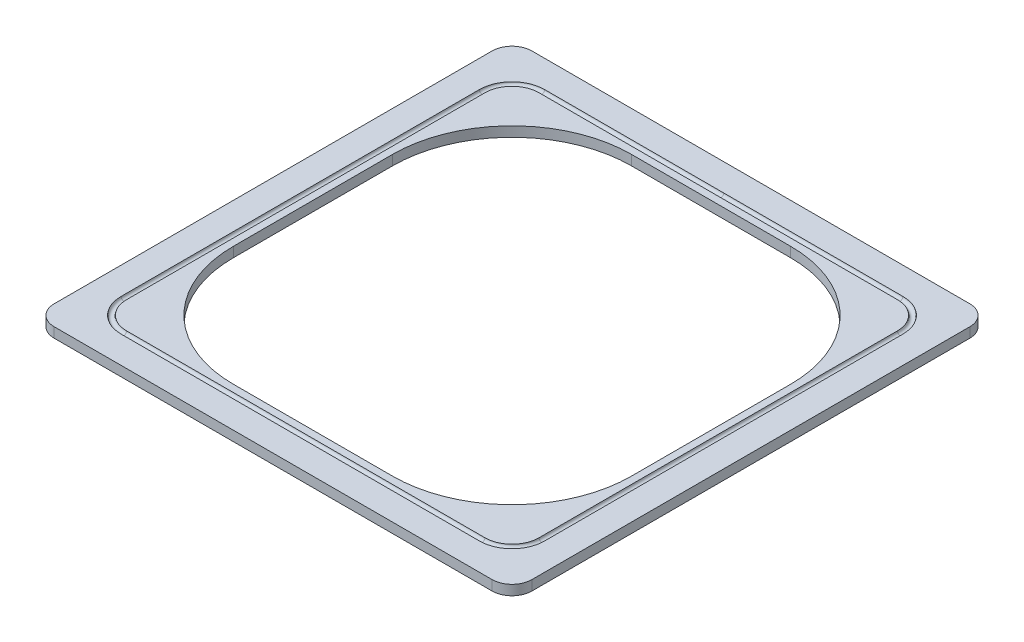
ISO-10303-21;
HEADER;
FILE_DESCRIPTION(('STEP AP214'),'2;1');
FILE_NAME('part.step','',(''),(''),'','','');
FILE_SCHEMA(('AUTOMOTIVE_DESIGN { 1 0 10303 214 1 1 1 1 }'));
ENDSEC;
DATA;
#1=APPLICATION_CONTEXT('core data for automotive mechanical design processes');
#2=APPLICATION_PROTOCOL_DEFINITION('international standard','automotive_design',2000,#1);
#3=PRODUCT_CONTEXT('',#1,'mechanical');
#4=PRODUCT('Part','Part','',(#3));
#5=PRODUCT_RELATED_PRODUCT_CATEGORY('part','',(#4));
#6=PRODUCT_DEFINITION_FORMATION('','',#4);
#7=PRODUCT_DEFINITION_CONTEXT('part definition',#1,'design');
#8=PRODUCT_DEFINITION('design','',#6,#7);
#9=PRODUCT_DEFINITION_SHAPE('','',#8);
#10=(LENGTH_UNIT() NAMED_UNIT(*) SI_UNIT(.MILLI.,.METRE.));
#11=(NAMED_UNIT(*) PLANE_ANGLE_UNIT() SI_UNIT($,.RADIAN.));
#12=(NAMED_UNIT(*) SI_UNIT($,.STERADIAN.) SOLID_ANGLE_UNIT());
#13=UNCERTAINTY_MEASURE_WITH_UNIT(LENGTH_MEASURE(1.E-05),#10,'distance_accuracy_value','');
#14=(GEOMETRIC_REPRESENTATION_CONTEXT(3) GLOBAL_UNCERTAINTY_ASSIGNED_CONTEXT((#13)) GLOBAL_UNIT_ASSIGNED_CONTEXT((#10,
#11,#12)) REPRESENTATION_CONTEXT('',''));
#15=CARTESIAN_POINT('',(0.,0.,0.));
#16=DIRECTION('',(0.,0.,1.));
#17=DIRECTION('',(1.,0.,0.));
#18=AXIS2_PLACEMENT_3D('',#15,#16,#17);
#19=CARTESIAN_POINT('',(0.,6.35,0.));
#20=DIRECTION('',(0.,-1.,0.));
#21=DIRECTION('',(0.,0.,-1.));
#22=AXIS2_PLACEMENT_3D('',#19,#20,#21);
#23=PLANE('',#22);
#24=CARTESIAN_POINT('',(-114.3,6.35,-114.3));
#25=DIRECTION('',(0.,-1.,0.));
#26=DIRECTION('',(0.,0.,-1.));
#27=AXIS2_PLACEMENT_3D('',#24,#25,#26);
#28=CIRCLE('',#27,20.8153);
#29=CARTESIAN_POINT('',(-135.1153,6.35,-114.3));
#30=VERTEX_POINT('',#29);
#31=CARTESIAN_POINT('',(-114.3,6.35,-135.1153));
#32=VERTEX_POINT('',#31);
#33=EDGE_CURVE('E48',#30,#32,#28,.T.);
#34=ORIENTED_EDGE('',*,*,#33,.T.);
#35=DIRECTION('',(1.,0.,0.));
#36=VECTOR('',#35,1.);
#37=CARTESIAN_POINT('',(-114.3,6.35,-135.1153));
#38=LINE('',#37,#36);
#39=CARTESIAN_POINT('',(0.,6.35,-135.1153));
#40=VERTEX_POINT('',#39);
#41=EDGE_CURVE('E11',#32,#40,#38,.T.);
#42=ORIENTED_EDGE('',*,*,#41,.T.);
#43=DIRECTION('',(1.,0.,0.));
#44=VECTOR('',#43,1.);
#45=CARTESIAN_POINT('',(0.,6.35,-135.1153));
#46=LINE('',#45,#44);
#47=CARTESIAN_POINT('',(114.3,6.35,-135.1153));
#48=VERTEX_POINT('',#47);
#49=EDGE_CURVE('E256',#40,#48,#46,.T.);
#50=ORIENTED_EDGE('',*,*,#49,.T.);
#51=CARTESIAN_POINT('',(114.3,6.35,-114.3));
#52=DIRECTION('',(0.,-1.,0.));
#53=DIRECTION('',(0.,0.,-1.));
#54=AXIS2_PLACEMENT_3D('',#51,#52,#53);
#55=CIRCLE('',#54,20.8153);
#56=CARTESIAN_POINT('',(135.1153,6.35,-114.3));
#57=VERTEX_POINT('',#56);
#58=EDGE_CURVE('E218',#48,#57,#55,.T.);
#59=ORIENTED_EDGE('',*,*,#58,.T.);
#60=DIRECTION('',(0.,0.,1.));
#61=VECTOR('',#60,1.);
#62=CARTESIAN_POINT('',(135.1153,6.35,-114.3));
#63=LINE('',#62,#61);
#64=CARTESIAN_POINT('',(135.1153,6.35,114.3));
#65=VERTEX_POINT('',#64);
#66=EDGE_CURVE('E261',#57,#65,#63,.T.);
#67=ORIENTED_EDGE('',*,*,#66,.T.);
#68=CARTESIAN_POINT('',(114.3,6.35,114.3));
#69=DIRECTION('',(0.,-1.,0.));
#70=DIRECTION('',(0.,0.,-1.));
#71=AXIS2_PLACEMENT_3D('',#68,#69,#70);
#72=CIRCLE('',#71,20.8153);
#73=CARTESIAN_POINT('',(114.3,6.35,135.1153));
#74=VERTEX_POINT('',#73);
#75=EDGE_CURVE('E265',#65,#74,#72,.T.);
#76=ORIENTED_EDGE('',*,*,#75,.T.);
#77=DIRECTION('',(-1.,0.,0.));
#78=VECTOR('',#77,1.);
#79=CARTESIAN_POINT('',(114.3,6.35,135.1153));
#80=LINE('',#79,#78);
#81=CARTESIAN_POINT('',(-114.3,6.35,135.1153));
#82=VERTEX_POINT('',#81);
#83=EDGE_CURVE('E269',#74,#82,#80,.T.);
#84=ORIENTED_EDGE('',*,*,#83,.T.);
#85=CARTESIAN_POINT('',(-114.3,6.35,114.3));
#86=DIRECTION('',(0.,-1.,0.));
#87=DIRECTION('',(0.,0.,-1.));
#88=AXIS2_PLACEMENT_3D('',#85,#86,#87);
#89=CIRCLE('',#88,20.8153);
#90=CARTESIAN_POINT('',(-135.1153,6.35,114.3));
#91=VERTEX_POINT('',#90);
#92=EDGE_CURVE('E273',#82,#91,#89,.T.);
#93=ORIENTED_EDGE('',*,*,#92,.T.);
#94=DIRECTION('',(0.,0.,-1.));
#95=VECTOR('',#94,1.);
#96=CARTESIAN_POINT('',(-135.1153,6.35,114.3));
#97=LINE('',#96,#95);
#98=EDGE_CURVE('E277',#91,#30,#97,.T.);
#99=ORIENTED_EDGE('',*,*,#98,.T.);
#100=EDGE_LOOP('',(#34,#42,#50,#59,#67,#76,#84,#93,#99));
#101=FACE_BOUND('',#100,.T.);
#102=DIRECTION('',(0.,0.,1.));
#103=VECTOR('',#102,1.);
#104=CARTESIAN_POINT('',(-152.4,6.35,152.4));
#105=LINE('',#104,#103);
#106=CARTESIAN_POINT('',(-152.4,6.35,-139.7));
#107=VERTEX_POINT('',#106);
#108=CARTESIAN_POINT('',(-152.4,6.35,139.7));
#109=VERTEX_POINT('',#108);
#110=EDGE_CURVE('E348',#107,#109,#105,.T.);
#111=ORIENTED_EDGE('',*,*,#110,.T.);
#112=CARTESIAN_POINT('',(-139.7,6.35,139.7));
#113=DIRECTION('',(0.,-1.,0.));
#114=DIRECTION('',(0.,0.,-1.));
#115=AXIS2_PLACEMENT_3D('',#112,#113,#114);
#116=CIRCLE('',#115,12.7);
#117=CARTESIAN_POINT('',(-139.7,6.35,152.4));
#118=VERTEX_POINT('',#117);
#119=EDGE_CURVE('E457',#109,#118,#116,.F.);
#120=ORIENTED_EDGE('',*,*,#119,.T.);
#121=DIRECTION('',(1.,0.,0.));
#122=VECTOR('',#121,1.);
#123=CARTESIAN_POINT('',(-152.4,6.35,152.4));
#124=LINE('',#123,#122);
#125=CARTESIAN_POINT('',(139.7,6.35,152.4));
#126=VERTEX_POINT('',#125);
#127=EDGE_CURVE('E352',#118,#126,#124,.T.);
#128=ORIENTED_EDGE('',*,*,#127,.T.);
#129=CARTESIAN_POINT('',(139.7,6.35,139.7));
#130=DIRECTION('',(0.,-1.,0.));
#131=DIRECTION('',(0.,0.,-1.));
#132=AXIS2_PLACEMENT_3D('',#129,#130,#131);
#133=CIRCLE('',#132,12.7);
#134=CARTESIAN_POINT('',(152.4,6.35,139.7));
#135=VERTEX_POINT('',#134);
#136=EDGE_CURVE('E448',#126,#135,#133,.F.);
#137=ORIENTED_EDGE('',*,*,#136,.T.);
#138=DIRECTION('',(0.,0.,-1.));
#139=VECTOR('',#138,1.);
#140=CARTESIAN_POINT('',(152.4,6.35,152.4));
#141=LINE('',#140,#139);
#142=CARTESIAN_POINT('',(152.4,6.35,-139.7));
#143=VERTEX_POINT('',#142);
#144=EDGE_CURVE('E339',#135,#143,#141,.T.);
#145=ORIENTED_EDGE('',*,*,#144,.T.);
#146=CARTESIAN_POINT('',(139.7,6.35,-139.7));
#147=DIRECTION('',(0.,-1.,0.));
#148=DIRECTION('',(0.,0.,-1.));
#149=AXIS2_PLACEMENT_3D('',#146,#147,#148);
#150=CIRCLE('',#149,12.7);
#151=CARTESIAN_POINT('',(139.7,6.35,-152.4));
#152=VERTEX_POINT('',#151);
#153=EDGE_CURVE('E451',#143,#152,#150,.F.);
#154=ORIENTED_EDGE('',*,*,#153,.T.);
#155=DIRECTION('',(-1.,0.,0.));
#156=VECTOR('',#155,1.);
#157=CARTESIAN_POINT('',(-152.4,6.35,-152.4));
#158=LINE('',#157,#156);
#159=CARTESIAN_POINT('',(-139.7,6.35,-152.4));
#160=VERTEX_POINT('',#159);
#161=EDGE_CURVE('E343',#152,#160,#158,.T.);
#162=ORIENTED_EDGE('',*,*,#161,.T.);
#163=CARTESIAN_POINT('',(-139.7,6.35,-139.7));
#164=DIRECTION('',(0.,-1.,0.));
#165=DIRECTION('',(0.,0.,-1.));
#166=AXIS2_PLACEMENT_3D('',#163,#164,#165);
#167=CIRCLE('',#166,12.7);
#168=EDGE_CURVE('E454',#160,#107,#167,.F.);
#169=ORIENTED_EDGE('',*,*,#168,.T.);
#170=EDGE_LOOP('',(#111,#120,#128,#137,#145,#154,#162,#169));
#171=FACE_BOUND('',#170,.T.);
#172=ADVANCED_FACE('F39',(#101,#171),#23,.F.);
#173=DIRECTION('',(1.,0.,0.));
#174=VECTOR('',#173,1.);
#175=CARTESIAN_POINT('',(0.,6.35,-131.5847));
#176=LINE('',#175,#174);
#177=CARTESIAN_POINT('',(114.3,6.35,-131.5847));
#178=VERTEX_POINT('',#177);
#179=CARTESIAN_POINT('',(0.,6.35,-131.5847));
#180=VERTEX_POINT('',#179);
#181=EDGE_CURVE('E204',#178,#180,#176,.F.);
#182=ORIENTED_EDGE('',*,*,#181,.T.);
#183=DIRECTION('',(1.,0.,0.));
#184=VECTOR('',#183,1.);
#185=CARTESIAN_POINT('',(-114.3,6.35,-131.5847));
#186=LINE('',#185,#184);
#187=CARTESIAN_POINT('',(-114.3,6.35,-131.5847));
#188=VERTEX_POINT('',#187);
#189=EDGE_CURVE('E253',#180,#188,#186,.F.);
#190=ORIENTED_EDGE('',*,*,#189,.T.);
#191=CARTESIAN_POINT('',(-114.3,6.35,-114.3));
#192=DIRECTION('',(0.,1.,0.));
#193=DIRECTION('',(0.,0.,1.));
#194=AXIS2_PLACEMENT_3D('',#191,#192,#193);
#195=CIRCLE('',#194,17.2847);
#196=CARTESIAN_POINT('',(-131.5847,6.35,-114.3));
#197=VERTEX_POINT('',#196);
#198=EDGE_CURVE('E249',#188,#197,#195,.T.);
#199=ORIENTED_EDGE('',*,*,#198,.T.);
#200=DIRECTION('',(0.,0.,-1.));
#201=VECTOR('',#200,1.);
#202=CARTESIAN_POINT('',(-131.5847,6.35,114.3));
#203=LINE('',#202,#201);
#204=CARTESIAN_POINT('',(-131.5847,6.35,114.3));
#205=VERTEX_POINT('',#204);
#206=EDGE_CURVE('E245',#197,#205,#203,.F.);
#207=ORIENTED_EDGE('',*,*,#206,.T.);
#208=CARTESIAN_POINT('',(-114.3,6.35,114.3));
#209=DIRECTION('',(0.,1.,0.));
#210=DIRECTION('',(0.,0.,1.));
#211=AXIS2_PLACEMENT_3D('',#208,#209,#210);
#212=CIRCLE('',#211,17.2847);
#213=CARTESIAN_POINT('',(-114.3,6.35,131.5847));
#214=VERTEX_POINT('',#213);
#215=EDGE_CURVE('E241',#205,#214,#212,.T.);
#216=ORIENTED_EDGE('',*,*,#215,.T.);
#217=DIRECTION('',(-1.,0.,0.));
#218=VECTOR('',#217,1.);
#219=CARTESIAN_POINT('',(114.3,6.35,131.5847));
#220=LINE('',#219,#218);
#221=CARTESIAN_POINT('',(114.3,6.35,131.5847));
#222=VERTEX_POINT('',#221);
#223=EDGE_CURVE('E237',#214,#222,#220,.F.);
#224=ORIENTED_EDGE('',*,*,#223,.T.);
#225=CARTESIAN_POINT('',(114.3,6.35,114.3));
#226=DIRECTION('',(0.,1.,0.));
#227=DIRECTION('',(0.,0.,1.));
#228=AXIS2_PLACEMENT_3D('',#225,#226,#227);
#229=CIRCLE('',#228,17.2847);
#230=CARTESIAN_POINT('',(131.5847,6.35,114.3));
#231=VERTEX_POINT('',#230);
#232=EDGE_CURVE('E231',#222,#231,#229,.T.);
#233=ORIENTED_EDGE('',*,*,#232,.T.);
#234=DIRECTION('',(0.,0.,1.));
#235=VECTOR('',#234,1.);
#236=CARTESIAN_POINT('',(131.5847,6.35,-114.3));
#237=LINE('',#236,#235);
#238=CARTESIAN_POINT('',(131.5847,6.35,-114.3));
#239=VERTEX_POINT('',#238);
#240=EDGE_CURVE('E227',#231,#239,#237,.F.);
#241=ORIENTED_EDGE('',*,*,#240,.T.);
#242=CARTESIAN_POINT('',(114.3,6.35,-114.3));
#243=DIRECTION('',(0.,1.,0.));
#244=DIRECTION('',(0.,0.,1.));
#245=AXIS2_PLACEMENT_3D('',#242,#243,#244);
#246=CIRCLE('',#245,17.2847);
#247=EDGE_CURVE('E210',#239,#178,#246,.T.);
#248=ORIENTED_EDGE('',*,*,#247,.T.);
#249=EDGE_LOOP('',(#182,#190,#199,#207,#216,#224,#233,#241,#248));
#250=FACE_BOUND('',#249,.T.);
#251=DIRECTION('',(0.,0.,1.));
#252=VECTOR('',#251,1.);
#253=CARTESIAN_POINT('',(-127.,6.35,127.));
#254=LINE('',#253,#252);
#255=CARTESIAN_POINT('',(-127.,6.35,-50.8));
#256=VERTEX_POINT('',#255);
#257=CARTESIAN_POINT('',(-127.,6.35,50.8));
#258=VERTEX_POINT('',#257);
#259=EDGE_CURVE('E307',#256,#258,#254,.T.);
#260=ORIENTED_EDGE('',*,*,#259,.F.);
#261=CARTESIAN_POINT('',(-50.8000000000001,6.35,-50.8));
#262=DIRECTION('',(0.,-1.,0.));
#263=DIRECTION('',(0.,0.,-1.));
#264=AXIS2_PLACEMENT_3D('',#261,#262,#263);
#265=CIRCLE('',#264,76.2);
#266=CARTESIAN_POINT('',(-50.8000000000001,6.35,-127.));
#267=VERTEX_POINT('',#266);
#268=EDGE_CURVE('E413',#256,#267,#265,.T.);
#269=ORIENTED_EDGE('',*,*,#268,.T.);
#270=DIRECTION('',(-1.,0.,0.));
#271=VECTOR('',#270,1.);
#272=CARTESIAN_POINT('',(-127.,6.35,-127.));
#273=LINE('',#272,#271);
#274=CARTESIAN_POINT('',(50.8,6.35,-127.));
#275=VERTEX_POINT('',#274);
#276=EDGE_CURVE('E320',#275,#267,#273,.T.);
#277=ORIENTED_EDGE('',*,*,#276,.F.);
#278=CARTESIAN_POINT('',(50.7999999999999,6.35,-50.8));
#279=DIRECTION('',(0.,-1.,0.));
#280=DIRECTION('',(0.,0.,-1.));
#281=AXIS2_PLACEMENT_3D('',#278,#279,#280);
#282=CIRCLE('',#281,76.2);
#283=CARTESIAN_POINT('',(127.,6.35,-50.8));
#284=VERTEX_POINT('',#283);
#285=EDGE_CURVE('E419',#275,#284,#282,.T.);
#286=ORIENTED_EDGE('',*,*,#285,.T.);
#287=DIRECTION('',(0.,0.,-1.));
#288=VECTOR('',#287,1.);
#289=CARTESIAN_POINT('',(127.,6.35,127.));
#290=LINE('',#289,#288);
#291=CARTESIAN_POINT('',(127.,6.35,50.8));
#292=VERTEX_POINT('',#291);
#293=EDGE_CURVE('E316',#292,#284,#290,.T.);
#294=ORIENTED_EDGE('',*,*,#293,.F.);
#295=CARTESIAN_POINT('',(50.8,6.35,50.8));
#296=DIRECTION('',(0.,-1.,0.));
#297=DIRECTION('',(0.,0.,-1.));
#298=AXIS2_PLACEMENT_3D('',#295,#296,#297);
#299=CIRCLE('',#298,76.2);
#300=CARTESIAN_POINT('',(50.8,6.35,127.));
#301=VERTEX_POINT('',#300);
#302=EDGE_CURVE('E401',#292,#301,#299,.T.);
#303=ORIENTED_EDGE('',*,*,#302,.T.);
#304=DIRECTION('',(1.,0.,0.));
#305=VECTOR('',#304,1.);
#306=CARTESIAN_POINT('',(-127.,6.35,127.));
#307=LINE('',#306,#305);
#308=CARTESIAN_POINT('',(-50.8000000000001,6.35,127.));
#309=VERTEX_POINT('',#308);
#310=EDGE_CURVE('E311',#309,#301,#307,.T.);
#311=ORIENTED_EDGE('',*,*,#310,.F.);
#312=CARTESIAN_POINT('',(-50.8000000000001,6.35,50.8));
#313=DIRECTION('',(0.,-1.,0.));
#314=DIRECTION('',(0.,0.,-1.));
#315=AXIS2_PLACEMENT_3D('',#312,#313,#314);
#316=CIRCLE('',#315,76.2);
#317=EDGE_CURVE('E407',#309,#258,#316,.T.);
#318=ORIENTED_EDGE('',*,*,#317,.T.);
#319=EDGE_LOOP('',(#260,#269,#277,#286,#294,#303,#311,#318));
#320=FACE_BOUND('',#319,.T.);
#321=ADVANCED_FACE('F224',(#250,#320),#23,.F.);
#322=CARTESIAN_POINT('',(0.,0.,0.));
#323=DIRECTION('',(0.,-1.,0.));
#324=DIRECTION('',(0.,0.,-1.));
#325=AXIS2_PLACEMENT_3D('',#322,#323,#324);
#326=PLANE('',#325);
#327=DIRECTION('',(1.,0.,0.));
#328=VECTOR('',#327,1.);
#329=CARTESIAN_POINT('',(-152.4,0.,152.4));
#330=LINE('',#329,#328);
#331=CARTESIAN_POINT('',(-139.7,0.,152.4));
#332=VERTEX_POINT('',#331);
#333=CARTESIAN_POINT('',(139.7,0.,152.4));
#334=VERTEX_POINT('',#333);
#335=EDGE_CURVE('E344',#332,#334,#330,.T.);
#336=ORIENTED_EDGE('',*,*,#335,.F.);
#337=CARTESIAN_POINT('',(-139.7,0.,139.7));
#338=DIRECTION('',(0.,-1.,0.));
#339=DIRECTION('',(0.,0.,-1.));
#340=AXIS2_PLACEMENT_3D('',#337,#338,#339);
#341=CIRCLE('',#340,12.7);
#342=CARTESIAN_POINT('',(-152.4,0.,139.7));
#343=VERTEX_POINT('',#342);
#344=EDGE_CURVE('E438',#332,#343,#341,.T.);
#345=ORIENTED_EDGE('',*,*,#344,.T.);
#346=DIRECTION('',(0.,0.,1.));
#347=VECTOR('',#346,1.);
#348=CARTESIAN_POINT('',(-152.4,0.,152.4));
#349=LINE('',#348,#347);
#350=CARTESIAN_POINT('',(-152.4,0.,-139.7));
#351=VERTEX_POINT('',#350);
#352=EDGE_CURVE('E364',#351,#343,#349,.T.);
#353=ORIENTED_EDGE('',*,*,#352,.F.);
#354=CARTESIAN_POINT('',(-139.7,0.,-139.7));
#355=DIRECTION('',(0.,-1.,0.));
#356=DIRECTION('',(0.,0.,-1.));
#357=AXIS2_PLACEMENT_3D('',#354,#355,#356);
#358=CIRCLE('',#357,12.7);
#359=CARTESIAN_POINT('',(-139.7,0.,-152.4));
#360=VERTEX_POINT('',#359);
#361=EDGE_CURVE('E435',#351,#360,#358,.T.);
#362=ORIENTED_EDGE('',*,*,#361,.T.);
#363=DIRECTION('',(-1.,0.,0.));
#364=VECTOR('',#363,1.);
#365=CARTESIAN_POINT('',(-152.4,0.,-152.4));
#366=LINE('',#365,#364);
#367=CARTESIAN_POINT('',(139.7,0.,-152.4));
#368=VERTEX_POINT('',#367);
#369=EDGE_CURVE('E360',#368,#360,#366,.T.);
#370=ORIENTED_EDGE('',*,*,#369,.F.);
#371=CARTESIAN_POINT('',(139.7,0.,-139.7));
#372=DIRECTION('',(0.,-1.,0.));
#373=DIRECTION('',(0.,0.,-1.));
#374=AXIS2_PLACEMENT_3D('',#371,#372,#373);
#375=CIRCLE('',#374,12.7);
#376=CARTESIAN_POINT('',(152.4,0.,-139.7));
#377=VERTEX_POINT('',#376);
#378=EDGE_CURVE('E432',#368,#377,#375,.T.);
#379=ORIENTED_EDGE('',*,*,#378,.T.);
#380=DIRECTION('',(0.,0.,-1.));
#381=VECTOR('',#380,1.);
#382=CARTESIAN_POINT('',(152.4,0.,152.4));
#383=LINE('',#382,#381);
#384=CARTESIAN_POINT('',(152.4,0.,139.7));
#385=VERTEX_POINT('',#384);
#386=EDGE_CURVE('E324',#385,#377,#383,.T.);
#387=ORIENTED_EDGE('',*,*,#386,.F.);
#388=CARTESIAN_POINT('',(139.7,0.,139.7));
#389=DIRECTION('',(0.,-1.,0.));
#390=DIRECTION('',(0.,0.,-1.));
#391=AXIS2_PLACEMENT_3D('',#388,#389,#390);
#392=CIRCLE('',#391,12.7);
#393=EDGE_CURVE('E429',#385,#334,#392,.T.);
#394=ORIENTED_EDGE('',*,*,#393,.T.);
#395=EDGE_LOOP('',(#336,#345,#353,#362,#370,#379,#387,#394));
#396=FACE_BOUND('',#395,.T.);
#397=DIRECTION('',(0.,0.,-1.));
#398=VECTOR('',#397,1.);
#399=CARTESIAN_POINT('',(127.,0.,127.));
#400=LINE('',#399,#398);
#401=CARTESIAN_POINT('',(127.,0.,50.8));
#402=VERTEX_POINT('',#401);
#403=CARTESIAN_POINT('',(127.,0.,-50.8));
#404=VERTEX_POINT('',#403);
#405=EDGE_CURVE('E332',#402,#404,#400,.T.);
#406=ORIENTED_EDGE('',*,*,#405,.T.);
#407=CARTESIAN_POINT('',(50.7999999999999,0.,-50.8));
#408=DIRECTION('',(0.,-1.,0.));
#409=DIRECTION('',(0.,0.,-1.));
#410=AXIS2_PLACEMENT_3D('',#407,#408,#409);
#411=CIRCLE('',#410,76.2);
#412=CARTESIAN_POINT('',(50.8,0.,-127.));
#413=VERTEX_POINT('',#412);
#414=EDGE_CURVE('E416',#404,#413,#411,.F.);
#415=ORIENTED_EDGE('',*,*,#414,.T.);
#416=DIRECTION('',(-1.,0.,0.));
#417=VECTOR('',#416,1.);
#418=CARTESIAN_POINT('',(-127.,0.,-127.));
#419=LINE('',#418,#417);
#420=CARTESIAN_POINT('',(-50.8000000000001,0.,-127.));
#421=VERTEX_POINT('',#420);
#422=EDGE_CURVE('E312',#413,#421,#419,.T.);
#423=ORIENTED_EDGE('',*,*,#422,.T.);
#424=CARTESIAN_POINT('',(-50.8000000000001,0.,-50.8));
#425=DIRECTION('',(0.,-1.,0.));
#426=DIRECTION('',(0.,0.,-1.));
#427=AXIS2_PLACEMENT_3D('',#424,#425,#426);
#428=CIRCLE('',#427,76.2);
#429=CARTESIAN_POINT('',(-127.,0.,-50.8));
#430=VERTEX_POINT('',#429);
#431=EDGE_CURVE('E410',#421,#430,#428,.F.);
#432=ORIENTED_EDGE('',*,*,#431,.T.);
#433=DIRECTION('',(0.,0.,1.));
#434=VECTOR('',#433,1.);
#435=CARTESIAN_POINT('',(-127.,0.,127.));
#436=LINE('',#435,#434);
#437=CARTESIAN_POINT('',(-127.,0.,50.8));
#438=VERTEX_POINT('',#437);
#439=EDGE_CURVE('E301',#430,#438,#436,.T.);
#440=ORIENTED_EDGE('',*,*,#439,.T.);
#441=CARTESIAN_POINT('',(-50.8000000000001,0.,50.8));
#442=DIRECTION('',(0.,-1.,0.));
#443=DIRECTION('',(0.,0.,-1.));
#444=AXIS2_PLACEMENT_3D('',#441,#442,#443);
#445=CIRCLE('',#444,76.2);
#446=CARTESIAN_POINT('',(-50.8000000000001,0.,127.));
#447=VERTEX_POINT('',#446);
#448=EDGE_CURVE('E404',#438,#447,#445,.F.);
#449=ORIENTED_EDGE('',*,*,#448,.T.);
#450=DIRECTION('',(1.,0.,0.));
#451=VECTOR('',#450,1.);
#452=CARTESIAN_POINT('',(-127.,0.,127.));
#453=LINE('',#452,#451);
#454=CARTESIAN_POINT('',(50.8,0.,127.));
#455=VERTEX_POINT('',#454);
#456=EDGE_CURVE('E328',#447,#455,#453,.T.);
#457=ORIENTED_EDGE('',*,*,#456,.T.);
#458=CARTESIAN_POINT('',(50.8,0.,50.8));
#459=DIRECTION('',(0.,-1.,0.));
#460=DIRECTION('',(0.,0.,-1.));
#461=AXIS2_PLACEMENT_3D('',#458,#459,#460);
#462=CIRCLE('',#461,76.2);
#463=EDGE_CURVE('E398',#455,#402,#462,.F.);
#464=ORIENTED_EDGE('',*,*,#463,.T.);
#465=EDGE_LOOP('',(#406,#415,#423,#432,#440,#449,#457,#464));
#466=FACE_BOUND('',#465,.T.);
#467=ADVANCED_FACE('F489',(#396,#466),#326,.T.);
#468=CARTESIAN_POINT('',(152.4,6.35,152.4));
#469=DIRECTION('',(-1.,0.,0.));
#470=DIRECTION('',(0.,0.,1.));
#471=AXIS2_PLACEMENT_3D('',#468,#469,#470);
#472=PLANE('',#471);
#473=ORIENTED_EDGE('',*,*,#386,.T.);
#474=DIRECTION('',(0.,-1.,0.));
#475=VECTOR('',#474,1.);
#476=CARTESIAN_POINT('',(152.4,6.35,-139.7));
#477=LINE('',#476,#475);
#478=EDGE_CURVE('E211',#377,#143,#477,.F.);
#479=ORIENTED_EDGE('',*,*,#478,.T.);
#480=ORIENTED_EDGE('',*,*,#144,.F.);
#481=DIRECTION('',(0.,-1.,0.));
#482=VECTOR('',#481,1.);
#483=CARTESIAN_POINT('',(152.4,6.35,139.7));
#484=LINE('',#483,#482);
#485=EDGE_CURVE('E467',#135,#385,#484,.T.);
#486=ORIENTED_EDGE('',*,*,#485,.T.);
#487=EDGE_LOOP('',(#473,#479,#480,#486));
#488=FACE_BOUND('',#487,.T.);
#489=ADVANCED_FACE('F474',(#488),#472,.F.);
#490=CARTESIAN_POINT('',(-152.4,6.35,-152.4));
#491=DIRECTION('',(0.,0.,1.));
#492=DIRECTION('',(1.,0.,0.));
#493=AXIS2_PLACEMENT_3D('',#490,#491,#492);
#494=PLANE('',#493);
#495=ORIENTED_EDGE('',*,*,#369,.T.);
#496=DIRECTION('',(0.,-1.,0.));
#497=VECTOR('',#496,1.);
#498=CARTESIAN_POINT('',(-139.7,6.35,-152.4));
#499=LINE('',#498,#497);
#500=EDGE_CURVE('E464',#360,#160,#499,.F.);
#501=ORIENTED_EDGE('',*,*,#500,.T.);
#502=ORIENTED_EDGE('',*,*,#161,.F.);
#503=DIRECTION('',(0.,-1.,0.));
#504=VECTOR('',#503,1.);
#505=CARTESIAN_POINT('',(139.7,6.35,-152.4));
#506=LINE('',#505,#504);
#507=EDGE_CURVE('E460',#152,#368,#506,.T.);
#508=ORIENTED_EDGE('',*,*,#507,.T.);
#509=EDGE_LOOP('',(#495,#501,#502,#508));
#510=FACE_BOUND('',#509,.T.);
#511=ADVANCED_FACE('F485',(#510),#494,.F.);
#512=CARTESIAN_POINT('',(-152.4,6.35,152.4));
#513=DIRECTION('',(1.,0.,0.));
#514=DIRECTION('',(0.,0.,-1.));
#515=AXIS2_PLACEMENT_3D('',#512,#513,#514);
#516=PLANE('',#515);
#517=ORIENTED_EDGE('',*,*,#352,.T.);
#518=DIRECTION('',(0.,-1.,0.));
#519=VECTOR('',#518,1.);
#520=CARTESIAN_POINT('',(-152.4,6.35,139.7));
#521=LINE('',#520,#519);
#522=EDGE_CURVE('E445',#343,#109,#521,.F.);
#523=ORIENTED_EDGE('',*,*,#522,.T.);
#524=ORIENTED_EDGE('',*,*,#110,.F.);
#525=DIRECTION('',(0.,-1.,0.));
#526=VECTOR('',#525,1.);
#527=CARTESIAN_POINT('',(-152.4,6.35,-139.7));
#528=LINE('',#527,#526);
#529=EDGE_CURVE('E441',#107,#351,#528,.T.);
#530=ORIENTED_EDGE('',*,*,#529,.T.);
#531=EDGE_LOOP('',(#517,#523,#524,#530));
#532=FACE_BOUND('',#531,.T.);
#533=ADVANCED_FACE('F498',(#532),#516,.F.);
#534=CARTESIAN_POINT('',(-152.4,6.35,152.4));
#535=DIRECTION('',(0.,0.,-1.));
#536=DIRECTION('',(-1.,0.,0.));
#537=AXIS2_PLACEMENT_3D('',#534,#535,#536);
#538=PLANE('',#537);
#539=ORIENTED_EDGE('',*,*,#127,.F.);
#540=DIRECTION('',(0.,-1.,0.));
#541=VECTOR('',#540,1.);
#542=CARTESIAN_POINT('',(-139.7,6.35,152.4));
#543=LINE('',#542,#541);
#544=EDGE_CURVE('E425',#118,#332,#543,.T.);
#545=ORIENTED_EDGE('',*,*,#544,.T.);
#546=ORIENTED_EDGE('',*,*,#335,.T.);
#547=DIRECTION('',(0.,-1.,0.));
#548=VECTOR('',#547,1.);
#549=CARTESIAN_POINT('',(139.7,6.35,152.4));
#550=LINE('',#549,#548);
#551=EDGE_CURVE('E422',#334,#126,#550,.F.);
#552=ORIENTED_EDGE('',*,*,#551,.T.);
#553=EDGE_LOOP('',(#539,#545,#546,#552));
#554=FACE_BOUND('',#553,.T.);
#555=ADVANCED_FACE('F506',(#554),#538,.F.);
#556=CARTESIAN_POINT('',(-127.,6.35,127.));
#557=DIRECTION('',(1.,0.,0.));
#558=DIRECTION('',(0.,0.,-1.));
#559=AXIS2_PLACEMENT_3D('',#556,#557,#558);
#560=PLANE('',#559);
#561=ORIENTED_EDGE('',*,*,#259,.T.);
#562=DIRECTION('',(0.,-1.,0.));
#563=VECTOR('',#562,1.);
#564=CARTESIAN_POINT('',(-127.,0.,50.8));
#565=LINE('',#564,#563);
#566=EDGE_CURVE('E387',#258,#438,#565,.T.);
#567=ORIENTED_EDGE('',*,*,#566,.T.);
#568=ORIENTED_EDGE('',*,*,#439,.F.);
#569=DIRECTION('',(0.,-1.,0.));
#570=VECTOR('',#569,1.);
#571=CARTESIAN_POINT('',(-127.,6.35,-50.8));
#572=LINE('',#571,#570);
#573=EDGE_CURVE('E384',#430,#256,#572,.F.);
#574=ORIENTED_EDGE('',*,*,#573,.T.);
#575=EDGE_LOOP('',(#561,#567,#568,#574));
#576=FACE_BOUND('',#575,.T.);
#577=ADVANCED_FACE('F524',(#576),#560,.T.);
#578=CARTESIAN_POINT('',(-127.,6.35,127.));
#579=DIRECTION('',(0.,0.,-1.));
#580=DIRECTION('',(-1.,0.,0.));
#581=AXIS2_PLACEMENT_3D('',#578,#579,#580);
#582=PLANE('',#581);
#583=ORIENTED_EDGE('',*,*,#310,.T.);
#584=DIRECTION('',(0.,-1.,0.));
#585=VECTOR('',#584,1.);
#586=CARTESIAN_POINT('',(50.8,0.,127.));
#587=LINE('',#586,#585);
#588=EDGE_CURVE('E373',#301,#455,#587,.T.);
#589=ORIENTED_EDGE('',*,*,#588,.T.);
#590=ORIENTED_EDGE('',*,*,#456,.F.);
#591=DIRECTION('',(0.,-1.,0.));
#592=VECTOR('',#591,1.);
#593=CARTESIAN_POINT('',(-50.8000000000001,6.35,127.));
#594=LINE('',#593,#592);
#595=EDGE_CURVE('E356',#447,#309,#594,.F.);
#596=ORIENTED_EDGE('',*,*,#595,.T.);
#597=EDGE_LOOP('',(#583,#589,#590,#596));
#598=FACE_BOUND('',#597,.T.);
#599=ADVANCED_FACE('F667',(#598),#582,.T.);
#600=CARTESIAN_POINT('',(127.,6.35,127.));
#601=DIRECTION('',(-1.,0.,0.));
#602=DIRECTION('',(0.,0.,1.));
#603=AXIS2_PLACEMENT_3D('',#600,#601,#602);
#604=PLANE('',#603);
#605=ORIENTED_EDGE('',*,*,#405,.F.);
#606=DIRECTION('',(0.,-1.,0.));
#607=VECTOR('',#606,1.);
#608=CARTESIAN_POINT('',(127.,6.35,50.8));
#609=LINE('',#608,#607);
#610=EDGE_CURVE('E381',#402,#292,#609,.F.);
#611=ORIENTED_EDGE('',*,*,#610,.T.);
#612=ORIENTED_EDGE('',*,*,#293,.T.);
#613=DIRECTION('',(0.,-1.,0.));
#614=VECTOR('',#613,1.);
#615=CARTESIAN_POINT('',(127.,0.,-50.8));
#616=LINE('',#615,#614);
#617=EDGE_CURVE('E377',#284,#404,#616,.T.);
#618=ORIENTED_EDGE('',*,*,#617,.T.);
#619=EDGE_LOOP('',(#605,#611,#612,#618));
#620=FACE_BOUND('',#619,.T.);
#621=ADVANCED_FACE('F664',(#620),#604,.T.);
#622=CARTESIAN_POINT('',(-127.,6.35,-127.));
#623=DIRECTION('',(0.,0.,1.));
#624=DIRECTION('',(1.,0.,0.));
#625=AXIS2_PLACEMENT_3D('',#622,#623,#624);
#626=PLANE('',#625);
#627=ORIENTED_EDGE('',*,*,#276,.T.);
#628=DIRECTION('',(0.,-1.,0.));
#629=VECTOR('',#628,1.);
#630=CARTESIAN_POINT('',(-50.8000000000001,0.,-127.));
#631=LINE('',#630,#629);
#632=EDGE_CURVE('E394',#267,#421,#631,.T.);
#633=ORIENTED_EDGE('',*,*,#632,.T.);
#634=ORIENTED_EDGE('',*,*,#422,.F.);
#635=DIRECTION('',(0.,-1.,0.));
#636=VECTOR('',#635,1.);
#637=CARTESIAN_POINT('',(50.7999999999999,6.35,-127.));
#638=LINE('',#637,#636);
#639=EDGE_CURVE('E391',#413,#275,#638,.F.);
#640=ORIENTED_EDGE('',*,*,#639,.T.);
#641=EDGE_LOOP('',(#627,#633,#634,#640));
#642=FACE_BOUND('',#641,.T.);
#643=ADVANCED_FACE('F540',(#642),#626,.T.);
#644=CARTESIAN_POINT('',(50.8,6.35,50.8));
#645=DIRECTION('',(0.,1.,0.));
#646=DIRECTION('',(0.,0.,1.));
#647=AXIS2_PLACEMENT_3D('',#644,#645,#646);
#648=CYLINDRICAL_SURFACE('',#647,76.2);
#649=ORIENTED_EDGE('',*,*,#302,.F.);
#650=ORIENTED_EDGE('',*,*,#610,.F.);
#651=ORIENTED_EDGE('',*,*,#463,.F.);
#652=ORIENTED_EDGE('',*,*,#588,.F.);
#653=EDGE_LOOP('',(#649,#650,#651,#652));
#654=FACE_BOUND('',#653,.T.);
#655=ADVANCED_FACE('F536',(#654),#648,.F.);
#656=CARTESIAN_POINT('',(-50.8000000000001,6.35,50.8));
#657=DIRECTION('',(0.,1.,0.));
#658=DIRECTION('',(0.,0.,1.));
#659=AXIS2_PLACEMENT_3D('',#656,#657,#658);
#660=CYLINDRICAL_SURFACE('',#659,76.2);
#661=ORIENTED_EDGE('',*,*,#317,.F.);
#662=ORIENTED_EDGE('',*,*,#595,.F.);
#663=ORIENTED_EDGE('',*,*,#448,.F.);
#664=ORIENTED_EDGE('',*,*,#566,.F.);
#665=EDGE_LOOP('',(#661,#662,#663,#664));
#666=FACE_BOUND('',#665,.T.);
#667=ADVANCED_FACE('F539',(#666),#660,.F.);
#668=CARTESIAN_POINT('',(-50.8000000000001,6.35,-50.8));
#669=DIRECTION('',(0.,1.,0.));
#670=DIRECTION('',(0.,0.,1.));
#671=AXIS2_PLACEMENT_3D('',#668,#669,#670);
#672=CYLINDRICAL_SURFACE('',#671,76.2);
#673=ORIENTED_EDGE('',*,*,#268,.F.);
#674=ORIENTED_EDGE('',*,*,#573,.F.);
#675=ORIENTED_EDGE('',*,*,#431,.F.);
#676=ORIENTED_EDGE('',*,*,#632,.F.);
#677=EDGE_LOOP('',(#673,#674,#675,#676));
#678=FACE_BOUND('',#677,.T.);
#679=ADVANCED_FACE('F544',(#678),#672,.F.);
#680=CARTESIAN_POINT('',(50.7999999999999,6.35,-50.8));
#681=DIRECTION('',(0.,1.,0.));
#682=DIRECTION('',(0.,0.,1.));
#683=AXIS2_PLACEMENT_3D('',#680,#681,#682);
#684=CYLINDRICAL_SURFACE('',#683,76.2);
#685=ORIENTED_EDGE('',*,*,#285,.F.);
#686=ORIENTED_EDGE('',*,*,#639,.F.);
#687=ORIENTED_EDGE('',*,*,#414,.F.);
#688=ORIENTED_EDGE('',*,*,#617,.F.);
#689=EDGE_LOOP('',(#685,#686,#687,#688));
#690=FACE_BOUND('',#689,.T.);
#691=ADVANCED_FACE('F548',(#690),#684,.F.);
#692=CARTESIAN_POINT('',(-139.7,6.35,139.7));
#693=DIRECTION('',(0.,-1.,0.));
#694=DIRECTION('',(0.,0.,-1.));
#695=AXIS2_PLACEMENT_3D('',#692,#693,#694);
#696=CYLINDRICAL_SURFACE('',#695,12.7);
#697=ORIENTED_EDGE('',*,*,#119,.F.);
#698=ORIENTED_EDGE('',*,*,#522,.F.);
#699=ORIENTED_EDGE('',*,*,#344,.F.);
#700=ORIENTED_EDGE('',*,*,#544,.F.);
#701=EDGE_LOOP('',(#697,#698,#699,#700));
#702=FACE_BOUND('',#701,.T.);
#703=ADVANCED_FACE('F504',(#702),#696,.T.);
#704=CARTESIAN_POINT('',(-139.7,6.35,-139.7));
#705=DIRECTION('',(0.,-1.,0.));
#706=DIRECTION('',(0.,0.,-1.));
#707=AXIS2_PLACEMENT_3D('',#704,#705,#706);
#708=CYLINDRICAL_SURFACE('',#707,12.7);
#709=ORIENTED_EDGE('',*,*,#168,.F.);
#710=ORIENTED_EDGE('',*,*,#500,.F.);
#711=ORIENTED_EDGE('',*,*,#361,.F.);
#712=ORIENTED_EDGE('',*,*,#529,.F.);
#713=EDGE_LOOP('',(#709,#710,#711,#712));
#714=FACE_BOUND('',#713,.T.);
#715=ADVANCED_FACE('F495',(#714),#708,.T.);
#716=CARTESIAN_POINT('',(139.7,6.35,-139.7));
#717=DIRECTION('',(0.,-1.,0.));
#718=DIRECTION('',(0.,0.,-1.));
#719=AXIS2_PLACEMENT_3D('',#716,#717,#718);
#720=CYLINDRICAL_SURFACE('',#719,12.7);
#721=ORIENTED_EDGE('',*,*,#153,.F.);
#722=ORIENTED_EDGE('',*,*,#478,.F.);
#723=ORIENTED_EDGE('',*,*,#378,.F.);
#724=ORIENTED_EDGE('',*,*,#507,.F.);
#725=EDGE_LOOP('',(#721,#722,#723,#724));
#726=FACE_BOUND('',#725,.T.);
#727=ADVANCED_FACE('F482',(#726),#720,.T.);
#728=CARTESIAN_POINT('',(139.7,6.35,139.7));
#729=DIRECTION('',(0.,-1.,0.));
#730=DIRECTION('',(0.,0.,-1.));
#731=AXIS2_PLACEMENT_3D('',#728,#729,#730);
#732=CYLINDRICAL_SURFACE('',#731,12.7);
#733=ORIENTED_EDGE('',*,*,#136,.F.);
#734=ORIENTED_EDGE('',*,*,#551,.F.);
#735=ORIENTED_EDGE('',*,*,#393,.F.);
#736=ORIENTED_EDGE('',*,*,#485,.F.);
#737=EDGE_LOOP('',(#733,#734,#735,#736));
#738=FACE_BOUND('',#737,.T.);
#739=ADVANCED_FACE('F41',(#738),#732,.T.);
#740=CARTESIAN_POINT('',(-114.3,6.35,-133.35));
#741=DIRECTION('',(1.,0.,0.));
#742=DIRECTION('',(0.,0.,-1.));
#743=AXIS2_PLACEMENT_3D('',#740,#741,#742);
#744=CYLINDRICAL_SURFACE('',#743,1.7653);
#745=CARTESIAN_POINT('',(-114.3,6.35,-133.35));
#746=DIRECTION('',(1.,0.,0.));
#747=DIRECTION('',(0.,0.,-1.));
#748=AXIS2_PLACEMENT_3D('',#745,#746,#747);
#749=CIRCLE('',#748,1.7653);
#750=EDGE_CURVE('E291',#188,#32,#749,.T.);
#751=ORIENTED_EDGE('',*,*,#750,.F.);
#752=ORIENTED_EDGE('',*,*,#189,.F.);
#753=CARTESIAN_POINT('',(0.,6.35,-133.35));
#754=DIRECTION('',(1.,0.,0.));
#755=DIRECTION('',(0.,0.,-1.));
#756=AXIS2_PLACEMENT_3D('',#753,#754,#755);
#757=CIRCLE('',#756,1.7653);
#758=EDGE_CURVE('E60',#180,#40,#757,.T.);
#759=ORIENTED_EDGE('',*,*,#758,.T.);
#760=ORIENTED_EDGE('',*,*,#41,.F.);
#761=EDGE_LOOP('',(#751,#752,#759,#760));
#762=FACE_BOUND('',#761,.T.);
#763=ADVANCED_FACE('F510',(#762),#744,.F.);
#764=CARTESIAN_POINT('',(-114.3,6.35,-114.3));
#765=DIRECTION('',(0.,-1.,0.));
#766=DIRECTION('',(0.,0.,-1.));
#767=AXIS2_PLACEMENT_3D('',#764,#765,#766);
#768=TOROIDAL_SURFACE('',#767,19.05,1.7653);
#769=CARTESIAN_POINT('',(-133.35,6.35,-114.3));
#770=DIRECTION('',(0.,0.,-1.));
#771=DIRECTION('',(-1.,0.,0.));
#772=AXIS2_PLACEMENT_3D('',#769,#770,#771);
#773=CIRCLE('',#772,1.7653);
#774=EDGE_CURVE('E289',#197,#30,#773,.T.);
#775=ORIENTED_EDGE('',*,*,#774,.F.);
#776=ORIENTED_EDGE('',*,*,#198,.F.);
#777=ORIENTED_EDGE('',*,*,#750,.T.);
#778=ORIENTED_EDGE('',*,*,#33,.F.);
#779=EDGE_LOOP('',(#775,#776,#777,#778));
#780=FACE_BOUND('',#779,.T.);
#781=ADVANCED_FACE('F288',(#780),#768,.F.);
#782=CARTESIAN_POINT('',(-133.35,6.35,114.3));
#783=DIRECTION('',(0.,0.,-1.));
#784=DIRECTION('',(-1.,0.,0.));
#785=AXIS2_PLACEMENT_3D('',#782,#783,#784);
#786=CYLINDRICAL_SURFACE('',#785,1.7653);
#787=CARTESIAN_POINT('',(-133.35,6.35,114.3));
#788=DIRECTION('',(0.,0.,-1.));
#789=DIRECTION('',(-1.,0.,0.));
#790=AXIS2_PLACEMENT_3D('',#787,#788,#789);
#791=CIRCLE('',#790,1.7653);
#792=EDGE_CURVE('E297',#205,#91,#791,.T.);
#793=ORIENTED_EDGE('',*,*,#792,.F.);
#794=ORIENTED_EDGE('',*,*,#206,.F.);
#795=ORIENTED_EDGE('',*,*,#774,.T.);
#796=ORIENTED_EDGE('',*,*,#98,.F.);
#797=EDGE_LOOP('',(#793,#794,#795,#796));
#798=FACE_BOUND('',#797,.T.);
#799=ADVANCED_FACE('F294',(#798),#786,.F.);
#800=CARTESIAN_POINT('',(-114.3,6.35,114.3));
#801=DIRECTION('',(0.,-1.,0.));
#802=DIRECTION('',(0.,0.,-1.));
#803=AXIS2_PLACEMENT_3D('',#800,#801,#802);
#804=TOROIDAL_SURFACE('',#803,19.05,1.7653);
#805=CARTESIAN_POINT('',(-114.3,6.35,133.35));
#806=DIRECTION('',(-1.,0.,0.));
#807=DIRECTION('',(0.,0.,1.));
#808=AXIS2_PLACEMENT_3D('',#805,#806,#807);
#809=CIRCLE('',#808,1.7653);
#810=EDGE_CURVE('E303',#214,#82,#809,.T.);
#811=ORIENTED_EDGE('',*,*,#810,.F.);
#812=ORIENTED_EDGE('',*,*,#215,.F.);
#813=ORIENTED_EDGE('',*,*,#792,.T.);
#814=ORIENTED_EDGE('',*,*,#92,.F.);
#815=EDGE_LOOP('',(#811,#812,#813,#814));
#816=FACE_BOUND('',#815,.T.);
#817=ADVANCED_FACE('F602',(#816),#804,.F.);
#818=CARTESIAN_POINT('',(114.3,6.35,133.35));
#819=DIRECTION('',(-1.,0.,0.));
#820=DIRECTION('',(0.,0.,1.));
#821=AXIS2_PLACEMENT_3D('',#818,#819,#820);
#822=CYLINDRICAL_SURFACE('',#821,1.7653);
#823=CARTESIAN_POINT('',(114.3,6.35,133.35));
#824=DIRECTION('',(-1.,0.,0.));
#825=DIRECTION('',(0.,0.,1.));
#826=AXIS2_PLACEMENT_3D('',#823,#824,#825);
#827=CIRCLE('',#826,1.7653);
#828=EDGE_CURVE('E782',#222,#74,#827,.T.);
#829=ORIENTED_EDGE('',*,*,#828,.F.);
#830=ORIENTED_EDGE('',*,*,#223,.F.);
#831=ORIENTED_EDGE('',*,*,#810,.T.);
#832=ORIENTED_EDGE('',*,*,#83,.F.);
#833=EDGE_LOOP('',(#829,#830,#831,#832));
#834=FACE_BOUND('',#833,.T.);
#835=ADVANCED_FACE('F611',(#834),#822,.F.);
#836=CARTESIAN_POINT('',(114.3,6.35,114.3));
#837=DIRECTION('',(0.,-1.,0.));
#838=DIRECTION('',(0.,0.,-1.));
#839=AXIS2_PLACEMENT_3D('',#836,#837,#838);
#840=TOROIDAL_SURFACE('',#839,19.05,1.7653);
#841=CARTESIAN_POINT('',(133.35,6.35,114.3));
#842=DIRECTION('',(0.,0.,1.));
#843=DIRECTION('',(1.,0.,0.));
#844=AXIS2_PLACEMENT_3D('',#841,#842,#843);
#845=CIRCLE('',#844,1.7653);
#846=EDGE_CURVE('E779',#231,#65,#845,.T.);
#847=ORIENTED_EDGE('',*,*,#846,.F.);
#848=ORIENTED_EDGE('',*,*,#232,.F.);
#849=ORIENTED_EDGE('',*,*,#828,.T.);
#850=ORIENTED_EDGE('',*,*,#75,.F.);
#851=EDGE_LOOP('',(#847,#848,#849,#850));
#852=FACE_BOUND('',#851,.T.);
#853=ADVANCED_FACE('F621',(#852),#840,.F.);
#854=CARTESIAN_POINT('',(133.35,6.35,-114.3));
#855=DIRECTION('',(0.,0.,1.));
#856=DIRECTION('',(1.,0.,0.));
#857=AXIS2_PLACEMENT_3D('',#854,#855,#856);
#858=CYLINDRICAL_SURFACE('',#857,1.7653);
#859=CARTESIAN_POINT('',(133.35,6.35,-114.3));
#860=DIRECTION('',(0.,0.,1.));
#861=DIRECTION('',(1.,0.,0.));
#862=AXIS2_PLACEMENT_3D('',#859,#860,#861);
#863=CIRCLE('',#862,1.7653);
#864=EDGE_CURVE('E221',#239,#57,#863,.T.);
#865=ORIENTED_EDGE('',*,*,#864,.F.);
#866=ORIENTED_EDGE('',*,*,#240,.F.);
#867=ORIENTED_EDGE('',*,*,#846,.T.);
#868=ORIENTED_EDGE('',*,*,#66,.F.);
#869=EDGE_LOOP('',(#865,#866,#867,#868));
#870=FACE_BOUND('',#869,.T.);
#871=ADVANCED_FACE('F631',(#870),#858,.F.);
#872=CARTESIAN_POINT('',(114.3,6.35,-114.3));
#873=DIRECTION('',(0.,-1.,0.));
#874=DIRECTION('',(0.,0.,-1.));
#875=AXIS2_PLACEMENT_3D('',#872,#873,#874);
#876=TOROIDAL_SURFACE('',#875,19.05,1.7653);
#877=CARTESIAN_POINT('',(114.3,6.35,-133.35));
#878=DIRECTION('',(1.,0.,0.));
#879=DIRECTION('',(0.,0.,-1.));
#880=AXIS2_PLACEMENT_3D('',#877,#878,#879);
#881=CIRCLE('',#880,1.7653);
#882=EDGE_CURVE('E55',#178,#48,#881,.T.);
#883=ORIENTED_EDGE('',*,*,#882,.F.);
#884=ORIENTED_EDGE('',*,*,#247,.F.);
#885=ORIENTED_EDGE('',*,*,#864,.T.);
#886=ORIENTED_EDGE('',*,*,#58,.F.);
#887=EDGE_LOOP('',(#883,#884,#885,#886));
#888=FACE_BOUND('',#887,.T.);
#889=ADVANCED_FACE('F214',(#888),#876,.F.);
#890=CARTESIAN_POINT('',(0.,6.35,-133.35));
#891=DIRECTION('',(1.,0.,0.));
#892=DIRECTION('',(0.,0.,-1.));
#893=AXIS2_PLACEMENT_3D('',#890,#891,#892);
#894=CYLINDRICAL_SURFACE('',#893,1.7653);
#895=ORIENTED_EDGE('',*,*,#758,.F.);
#896=ORIENTED_EDGE('',*,*,#181,.F.);
#897=ORIENTED_EDGE('',*,*,#882,.T.);
#898=ORIENTED_EDGE('',*,*,#49,.F.);
#899=EDGE_LOOP('',(#895,#896,#897,#898));
#900=FACE_BOUND('',#899,.T.);
#901=ADVANCED_FACE('F205',(#900),#894,.F.);
#902=CLOSED_SHELL('',(#172,#321,#467,#489,#511,#533,#555,#577,#599,#621,#643,#655,#667,#679,
#691,#703,#715,#727,#739,#763,#781,#799,#817,#835,#853,#871,#889,#901));
#903=MANIFOLD_SOLID_BREP('B2',#902);
#904=ADVANCED_BREP_SHAPE_REPRESENTATION('',(#18,#903),#14);
#905=SHAPE_DEFINITION_REPRESENTATION(#9,#904);
ENDSEC;
END-ISO-10303-21;
